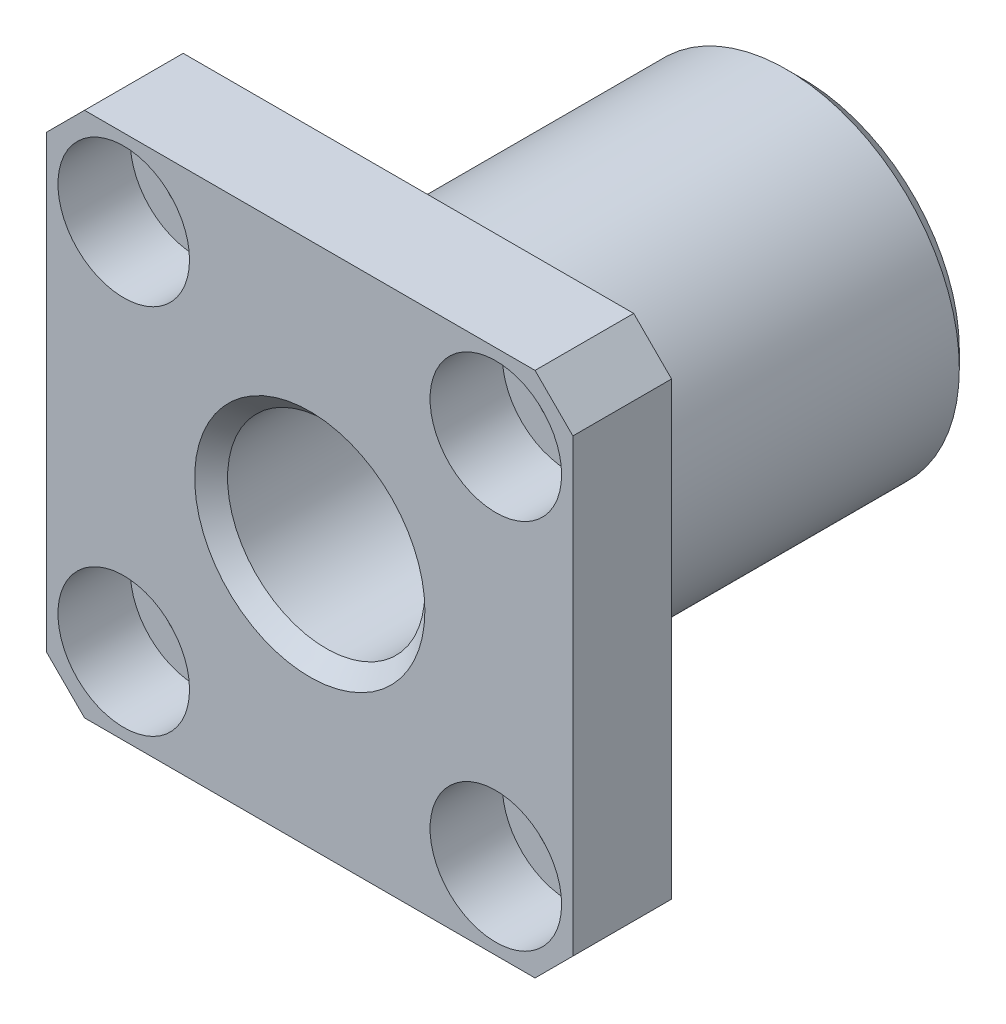
ISO-10303-21;
HEADER;
FILE_DESCRIPTION(('STEP AP214'),'2;1');
FILE_NAME('part.step','',(''),(''),'','','');
FILE_SCHEMA(('AUTOMOTIVE_DESIGN { 1 0 10303 214 1 1 1 1 }'));
ENDSEC;
DATA;
#1=APPLICATION_CONTEXT('core data for automotive mechanical design processes');
#2=APPLICATION_PROTOCOL_DEFINITION('international standard','automotive_design',2000,#1);
#3=PRODUCT_CONTEXT('',#1,'mechanical');
#4=PRODUCT('Part','Part','',(#3));
#5=PRODUCT_RELATED_PRODUCT_CATEGORY('part','',(#4));
#6=PRODUCT_DEFINITION_FORMATION('','',#4);
#7=PRODUCT_DEFINITION_CONTEXT('part definition',#1,'design');
#8=PRODUCT_DEFINITION('design','',#6,#7);
#9=PRODUCT_DEFINITION_SHAPE('','',#8);
#10=(LENGTH_UNIT() NAMED_UNIT(*) SI_UNIT(.MILLI.,.METRE.));
#11=(NAMED_UNIT(*) PLANE_ANGLE_UNIT() SI_UNIT($,.RADIAN.));
#12=(NAMED_UNIT(*) SI_UNIT($,.STERADIAN.) SOLID_ANGLE_UNIT());
#13=UNCERTAINTY_MEASURE_WITH_UNIT(LENGTH_MEASURE(1.E-05),#10,'distance_accuracy_value','');
#14=(GEOMETRIC_REPRESENTATION_CONTEXT(3) GLOBAL_UNCERTAINTY_ASSIGNED_CONTEXT((#13)) GLOBAL_UNIT_ASSIGNED_CONTEXT((#10,
#11,#12)) REPRESENTATION_CONTEXT('',''));
#15=CARTESIAN_POINT('',(0.,0.,0.));
#16=DIRECTION('',(0.,0.,1.));
#17=DIRECTION('',(1.,0.,0.));
#18=AXIS2_PLACEMENT_3D('',#15,#16,#17);
#19=CARTESIAN_POINT('',(0.,0.,30.));
#20=DIRECTION('',(0.,0.,-1.));
#21=DIRECTION('',(-1.,0.,0.));
#22=AXIS2_PLACEMENT_3D('',#19,#20,#21);
#23=CYLINDRICAL_SURFACE('',#22,10.5);
#24=CARTESIAN_POINT('',(0.,0.,1.00000000000001));
#25=DIRECTION('',(0.,0.,1.));
#26=DIRECTION('',(1.,0.,0.));
#27=AXIS2_PLACEMENT_3D('',#24,#25,#26);
#28=CIRCLE('',#27,10.5);
#29=CARTESIAN_POINT('',(10.5,0.,1.00000000000001));
#30=VERTEX_POINT('',#29);
#31=EDGE_CURVE('E141',#30,#30,#28,.T.);
#32=ORIENTED_EDGE('',*,*,#31,.T.);
#33=EDGE_LOOP('',(#32));
#34=FACE_BOUND('',#33,.T.);
#35=CARTESIAN_POINT('',(0.,0.,24.));
#36=DIRECTION('',(0.,0.,-1.));
#37=DIRECTION('',(-1.,0.,0.));
#38=AXIS2_PLACEMENT_3D('',#35,#36,#37);
#39=CIRCLE('',#38,10.5);
#40=CARTESIAN_POINT('',(-10.5,0.,24.));
#41=VERTEX_POINT('',#40);
#42=EDGE_CURVE('E138',#41,#41,#39,.T.);
#43=ORIENTED_EDGE('',*,*,#42,.T.);
#44=EDGE_LOOP('',(#43));
#45=FACE_BOUND('',#44,.T.);
#46=ADVANCED_FACE('F33',(#34,#45),#23,.T.);
#47=CARTESIAN_POINT('',(0.,0.,0.));
#48=DIRECTION('',(0.,0.,1.));
#49=DIRECTION('',(1.,0.,0.));
#50=AXIS2_PLACEMENT_3D('',#47,#48,#49);
#51=PLANE('',#50);
#52=CARTESIAN_POINT('',(0.,0.,0.));
#53=DIRECTION('',(0.,0.,1.));
#54=DIRECTION('',(1.,0.,0.));
#55=AXIS2_PLACEMENT_3D('',#52,#53,#54);
#56=CIRCLE('',#55,9.49999999999998);
#57=CARTESIAN_POINT('',(9.49999999999998,0.,0.));
#58=VERTEX_POINT('',#57);
#59=EDGE_CURVE('E164',#58,#58,#56,.F.);
#60=ORIENTED_EDGE('',*,*,#59,.T.);
#61=EDGE_LOOP('',(#60));
#62=FACE_BOUND('',#61,.T.);
#63=CARTESIAN_POINT('',(0.,0.,0.));
#64=DIRECTION('',(0.,0.,1.));
#65=DIRECTION('',(1.,0.,0.));
#66=AXIS2_PLACEMENT_3D('',#63,#64,#65);
#67=CIRCLE('',#66,6.);
#68=CARTESIAN_POINT('',(6.,0.,0.));
#69=VERTEX_POINT('',#68);
#70=EDGE_CURVE('E442',#69,#69,#67,.T.);
#71=ORIENTED_EDGE('',*,*,#70,.T.);
#72=EDGE_LOOP('',(#71));
#73=FACE_BOUND('',#72,.T.);
#74=ADVANCED_FACE('F181',(#62,#73),#51,.F.);
#75=CARTESIAN_POINT('',(16.,-16.,24.));
#76=DIRECTION('',(1.,0.,0.));
#77=DIRECTION('',(0.,0.,-1.));
#78=AXIS2_PLACEMENT_3D('',#75,#76,#77);
#79=PLANE('',#78);
#80=DIRECTION('',(0.,0.,1.));
#81=VECTOR('',#80,1.);
#82=CARTESIAN_POINT('',(16.,-13.698484809835,0.));
#83=LINE('',#82,#81);
#84=CARTESIAN_POINT('',(16.,-13.698484809835,24.));
#85=VERTEX_POINT('',#84);
#86=CARTESIAN_POINT('',(16.,-13.698484809835,30.));
#87=VERTEX_POINT('',#86);
#88=EDGE_CURVE('E474',#85,#87,#83,.T.);
#89=ORIENTED_EDGE('',*,*,#88,.F.);
#90=DIRECTION('',(0.,1.,0.));
#91=VECTOR('',#90,1.);
#92=CARTESIAN_POINT('',(16.,-16.,24.));
#93=LINE('',#92,#91);
#94=CARTESIAN_POINT('',(16.,13.698484809835,24.));
#95=VERTEX_POINT('',#94);
#96=EDGE_CURVE('E117',#85,#95,#93,.T.);
#97=ORIENTED_EDGE('',*,*,#96,.T.);
#98=DIRECTION('',(0.,0.,1.));
#99=VECTOR('',#98,1.);
#100=CARTESIAN_POINT('',(16.,13.698484809835,0.));
#101=LINE('',#100,#99);
#102=CARTESIAN_POINT('',(16.,13.698484809835,30.));
#103=VERTEX_POINT('',#102);
#104=EDGE_CURVE('E100',#95,#103,#101,.T.);
#105=ORIENTED_EDGE('',*,*,#104,.T.);
#106=DIRECTION('',(0.,1.,0.));
#107=VECTOR('',#106,1.);
#108=CARTESIAN_POINT('',(16.,-16.,30.));
#109=LINE('',#108,#107);
#110=EDGE_CURVE('E115',#87,#103,#109,.T.);
#111=ORIENTED_EDGE('',*,*,#110,.F.);
#112=EDGE_LOOP('',(#89,#97,#105,#111));
#113=FACE_BOUND('',#112,.T.);
#114=ADVANCED_FACE('F114',(#113),#79,.T.);
#115=CARTESIAN_POINT('',(-16.,-16.,24.));
#116=DIRECTION('',(0.,-1.,0.));
#117=DIRECTION('',(0.,0.,-1.));
#118=AXIS2_PLACEMENT_3D('',#115,#116,#117);
#119=PLANE('',#118);
#120=DIRECTION('',(0.,0.,1.));
#121=VECTOR('',#120,1.);
#122=CARTESIAN_POINT('',(-13.698484809835,-16.,0.));
#123=LINE('',#122,#121);
#124=CARTESIAN_POINT('',(-13.698484809835,-16.,24.));
#125=VERTEX_POINT('',#124);
#126=CARTESIAN_POINT('',(-13.698484809835,-16.,30.));
#127=VERTEX_POINT('',#126);
#128=EDGE_CURVE('E48',#125,#127,#123,.T.);
#129=ORIENTED_EDGE('',*,*,#128,.F.);
#130=DIRECTION('',(1.,0.,0.));
#131=VECTOR('',#130,1.);
#132=CARTESIAN_POINT('',(-16.,-16.,24.));
#133=LINE('',#132,#131);
#134=CARTESIAN_POINT('',(13.698484809835,-16.,24.));
#135=VERTEX_POINT('',#134);
#136=EDGE_CURVE('E131',#125,#135,#133,.T.);
#137=ORIENTED_EDGE('',*,*,#136,.T.);
#138=DIRECTION('',(0.,0.,1.));
#139=VECTOR('',#138,1.);
#140=CARTESIAN_POINT('',(13.698484809835,-16.,0.));
#141=LINE('',#140,#139);
#142=CARTESIAN_POINT('',(13.698484809835,-16.,30.));
#143=VERTEX_POINT('',#142);
#144=EDGE_CURVE('E108',#135,#143,#141,.T.);
#145=ORIENTED_EDGE('',*,*,#144,.T.);
#146=DIRECTION('',(1.,0.,0.));
#147=VECTOR('',#146,1.);
#148=CARTESIAN_POINT('',(-16.,-16.,30.));
#149=LINE('',#148,#147);
#150=EDGE_CURVE('E136',#127,#143,#149,.T.);
#151=ORIENTED_EDGE('',*,*,#150,.F.);
#152=EDGE_LOOP('',(#129,#137,#145,#151));
#153=FACE_BOUND('',#152,.T.);
#154=ADVANCED_FACE('F198',(#153),#119,.T.);
#155=CARTESIAN_POINT('',(-16.,-16.,24.));
#156=DIRECTION('',(-1.,0.,0.));
#157=DIRECTION('',(0.,0.,1.));
#158=AXIS2_PLACEMENT_3D('',#155,#156,#157);
#159=PLANE('',#158);
#160=DIRECTION('',(0.,0.,1.));
#161=VECTOR('',#160,1.);
#162=CARTESIAN_POINT('',(-16.,-13.698484809835,0.));
#163=LINE('',#162,#161);
#164=CARTESIAN_POINT('',(-16.,-13.698484809835,24.));
#165=VERTEX_POINT('',#164);
#166=CARTESIAN_POINT('',(-16.,-13.698484809835,30.));
#167=VERTEX_POINT('',#166);
#168=EDGE_CURVE('E479',#165,#167,#163,.T.);
#169=ORIENTED_EDGE('',*,*,#168,.T.);
#170=DIRECTION('',(0.,-1.,0.));
#171=VECTOR('',#170,1.);
#172=CARTESIAN_POINT('',(-16.,-16.,30.));
#173=LINE('',#172,#171);
#174=CARTESIAN_POINT('',(-16.,13.698484809835,30.));
#175=VERTEX_POINT('',#174);
#176=EDGE_CURVE('E126',#175,#167,#173,.T.);
#177=ORIENTED_EDGE('',*,*,#176,.F.);
#178=DIRECTION('',(0.,0.,1.));
#179=VECTOR('',#178,1.);
#180=CARTESIAN_POINT('',(-16.,13.698484809835,0.));
#181=LINE('',#180,#179);
#182=CARTESIAN_POINT('',(-16.,13.698484809835,24.));
#183=VERTEX_POINT('',#182);
#184=EDGE_CURVE('E56',#183,#175,#181,.T.);
#185=ORIENTED_EDGE('',*,*,#184,.F.);
#186=DIRECTION('',(0.,-1.,0.));
#187=VECTOR('',#186,1.);
#188=CARTESIAN_POINT('',(-16.,-16.,24.));
#189=LINE('',#188,#187);
#190=EDGE_CURVE('E496',#183,#165,#189,.T.);
#191=ORIENTED_EDGE('',*,*,#190,.T.);
#192=EDGE_LOOP('',(#169,#177,#185,#191));
#193=FACE_BOUND('',#192,.T.);
#194=ADVANCED_FACE('F202',(#193),#159,.T.);
#195=CARTESIAN_POINT('',(-16.,16.,24.));
#196=DIRECTION('',(0.,1.,0.));
#197=DIRECTION('',(0.,0.,1.));
#198=AXIS2_PLACEMENT_3D('',#195,#196,#197);
#199=PLANE('',#198);
#200=DIRECTION('',(0.,0.,1.));
#201=VECTOR('',#200,1.);
#202=CARTESIAN_POINT('',(13.698484809835,16.,0.));
#203=LINE('',#202,#201);
#204=CARTESIAN_POINT('',(13.698484809835,16.,24.));
#205=VERTEX_POINT('',#204);
#206=CARTESIAN_POINT('',(13.698484809835,16.,30.));
#207=VERTEX_POINT('',#206);
#208=EDGE_CURVE('E103',#205,#207,#203,.T.);
#209=ORIENTED_EDGE('',*,*,#208,.F.);
#210=DIRECTION('',(-1.,0.,0.));
#211=VECTOR('',#210,1.);
#212=CARTESIAN_POINT('',(-16.,16.,24.));
#213=LINE('',#212,#211);
#214=CARTESIAN_POINT('',(-13.698484809835,16.,24.));
#215=VERTEX_POINT('',#214);
#216=EDGE_CURVE('E494',#205,#215,#213,.T.);
#217=ORIENTED_EDGE('',*,*,#216,.T.);
#218=DIRECTION('',(0.,0.,1.));
#219=VECTOR('',#218,1.);
#220=CARTESIAN_POINT('',(-13.698484809835,16.,0.));
#221=LINE('',#220,#219);
#222=CARTESIAN_POINT('',(-13.698484809835,16.,30.));
#223=VERTEX_POINT('',#222);
#224=EDGE_CURVE('E484',#215,#223,#221,.T.);
#225=ORIENTED_EDGE('',*,*,#224,.T.);
#226=DIRECTION('',(-1.,0.,0.));
#227=VECTOR('',#226,1.);
#228=CARTESIAN_POINT('',(-16.,16.,30.));
#229=LINE('',#228,#227);
#230=EDGE_CURVE('E123',#207,#223,#229,.T.);
#231=ORIENTED_EDGE('',*,*,#230,.F.);
#232=EDGE_LOOP('',(#209,#217,#225,#231));
#233=FACE_BOUND('',#232,.T.);
#234=ADVANCED_FACE('F199',(#233),#199,.T.);
#235=CARTESIAN_POINT('',(0.,0.,24.));
#236=DIRECTION('',(0.,0.,-1.));
#237=DIRECTION('',(-1.,0.,0.));
#238=AXIS2_PLACEMENT_3D('',#235,#236,#237);
#239=PLANE('',#238);
#240=CARTESIAN_POINT('',(-11.3137084989848,11.3137084989848,24.));
#241=DIRECTION('',(0.,0.,-1.));
#242=DIRECTION('',(-1.,0.,0.));
#243=AXIS2_PLACEMENT_3D('',#240,#241,#242);
#244=CIRCLE('',#243,2.25);
#245=CARTESIAN_POINT('',(-13.5637084989848,11.3137084989848,24.));
#246=VERTEX_POINT('',#245);
#247=EDGE_CURVE('E157',#246,#246,#244,.T.);
#248=ORIENTED_EDGE('',*,*,#247,.F.);
#249=EDGE_LOOP('',(#248));
#250=FACE_BOUND('',#249,.T.);
#251=CARTESIAN_POINT('',(11.3137084989848,11.3137084989848,24.));
#252=DIRECTION('',(0.,0.,-1.));
#253=DIRECTION('',(-1.,0.,0.));
#254=AXIS2_PLACEMENT_3D('',#251,#252,#253);
#255=CIRCLE('',#254,2.25);
#256=CARTESIAN_POINT('',(9.06370849898476,11.3137084989848,24.));
#257=VERTEX_POINT('',#256);
#258=EDGE_CURVE('E152',#257,#257,#255,.T.);
#259=ORIENTED_EDGE('',*,*,#258,.F.);
#260=EDGE_LOOP('',(#259));
#261=FACE_BOUND('',#260,.T.);
#262=CARTESIAN_POINT('',(11.3137084989848,-11.3137084989848,24.));
#263=DIRECTION('',(0.,0.,-1.));
#264=DIRECTION('',(-1.,0.,0.));
#265=AXIS2_PLACEMENT_3D('',#262,#263,#264);
#266=CIRCLE('',#265,2.25);
#267=CARTESIAN_POINT('',(9.06370849898476,-11.3137084989848,24.));
#268=VERTEX_POINT('',#267);
#269=EDGE_CURVE('E147',#268,#268,#266,.T.);
#270=ORIENTED_EDGE('',*,*,#269,.F.);
#271=EDGE_LOOP('',(#270));
#272=FACE_BOUND('',#271,.T.);
#273=CARTESIAN_POINT('',(-11.3137084989848,-11.3137084989848,24.));
#274=DIRECTION('',(0.,0.,-1.));
#275=DIRECTION('',(-1.,0.,0.));
#276=AXIS2_PLACEMENT_3D('',#273,#274,#275);
#277=CIRCLE('',#276,2.25);
#278=CARTESIAN_POINT('',(-13.5637084989848,-11.3137084989848,24.));
#279=VERTEX_POINT('',#278);
#280=EDGE_CURVE('E142',#279,#279,#277,.T.);
#281=ORIENTED_EDGE('',*,*,#280,.F.);
#282=EDGE_LOOP('',(#281));
#283=FACE_BOUND('',#282,.T.);
#284=DIRECTION('',(0.707106781186548,-0.707106781186548,0.));
#285=VECTOR('',#284,1.);
#286=CARTESIAN_POINT('',(-14.8492424049175,-14.8492424049175,24.));
#287=LINE('',#286,#285);
#288=EDGE_CURVE('E124',#165,#125,#287,.T.);
#289=ORIENTED_EDGE('',*,*,#288,.F.);
#290=ORIENTED_EDGE('',*,*,#190,.F.);
#291=DIRECTION('',(-0.707106781186548,-0.707106781186548,0.));
#292=VECTOR('',#291,1.);
#293=CARTESIAN_POINT('',(-14.8492424049175,14.8492424049175,24.));
#294=LINE('',#293,#292);
#295=EDGE_CURVE('E487',#215,#183,#294,.T.);
#296=ORIENTED_EDGE('',*,*,#295,.F.);
#297=ORIENTED_EDGE('',*,*,#216,.F.);
#298=DIRECTION('',(-0.707106781186548,0.707106781186548,0.));
#299=VECTOR('',#298,1.);
#300=CARTESIAN_POINT('',(14.8492424049175,14.8492424049175,24.));
#301=LINE('',#300,#299);
#302=EDGE_CURVE('E490',#95,#205,#301,.T.);
#303=ORIENTED_EDGE('',*,*,#302,.F.);
#304=ORIENTED_EDGE('',*,*,#96,.F.);
#305=DIRECTION('',(0.707106781186548,0.707106781186548,0.));
#306=VECTOR('',#305,1.);
#307=CARTESIAN_POINT('',(14.8492424049175,-14.8492424049175,24.));
#308=LINE('',#307,#306);
#309=EDGE_CURVE('E128',#135,#85,#308,.T.);
#310=ORIENTED_EDGE('',*,*,#309,.F.);
#311=ORIENTED_EDGE('',*,*,#136,.F.);
#312=EDGE_LOOP('',(#289,#290,#296,#297,#303,#304,#310,#311));
#313=FACE_BOUND('',#312,.T.);
#314=ORIENTED_EDGE('',*,*,#42,.F.);
#315=EDGE_LOOP('',(#314));
#316=FACE_BOUND('',#315,.T.);
#317=ADVANCED_FACE('F194',(#250,#261,#272,#283,#313,#316),#239,.T.);
#318=CARTESIAN_POINT('',(0.,0.,30.));
#319=DIRECTION('',(0.,0.,1.));
#320=DIRECTION('',(1.,0.,0.));
#321=AXIS2_PLACEMENT_3D('',#318,#319,#320);
#322=PLANE('',#321);
#323=CARTESIAN_POINT('',(0.,0.,30.));
#324=DIRECTION('',(0.,0.,1.));
#325=DIRECTION('',(1.,0.,0.));
#326=AXIS2_PLACEMENT_3D('',#323,#324,#325);
#327=CIRCLE('',#326,7.00000000000001);
#328=CARTESIAN_POINT('',(7.00000000000001,0.,30.));
#329=VERTEX_POINT('',#328);
#330=EDGE_CURVE('E11',#329,#329,#327,.F.);
#331=ORIENTED_EDGE('',*,*,#330,.T.);
#332=EDGE_LOOP('',(#331));
#333=FACE_BOUND('',#332,.T.);
#334=CARTESIAN_POINT('',(-11.3137084989848,11.3137084989848,30.));
#335=DIRECTION('',(0.,0.,1.));
#336=DIRECTION('',(1.,0.,0.));
#337=AXIS2_PLACEMENT_3D('',#334,#335,#336);
#338=CIRCLE('',#337,4.);
#339=CARTESIAN_POINT('',(-7.31370849898476,11.3137084989848,30.));
#340=VERTEX_POINT('',#339);
#341=EDGE_CURVE('E440',#340,#340,#338,.T.);
#342=ORIENTED_EDGE('',*,*,#341,.F.);
#343=EDGE_LOOP('',(#342));
#344=FACE_BOUND('',#343,.T.);
#345=CARTESIAN_POINT('',(11.3137084989848,11.3137084989848,30.));
#346=DIRECTION('',(0.,0.,1.));
#347=DIRECTION('',(1.,0.,0.));
#348=AXIS2_PLACEMENT_3D('',#345,#346,#347);
#349=CIRCLE('',#348,4.);
#350=CARTESIAN_POINT('',(15.3137084989848,11.3137084989848,30.));
#351=VERTEX_POINT('',#350);
#352=EDGE_CURVE('E160',#351,#351,#349,.T.);
#353=ORIENTED_EDGE('',*,*,#352,.F.);
#354=EDGE_LOOP('',(#353));
#355=FACE_BOUND('',#354,.T.);
#356=CARTESIAN_POINT('',(11.3137084989848,-11.3137084989848,30.));
#357=DIRECTION('',(0.,0.,1.));
#358=DIRECTION('',(1.,0.,0.));
#359=AXIS2_PLACEMENT_3D('',#356,#357,#358);
#360=CIRCLE('',#359,4.);
#361=CARTESIAN_POINT('',(15.3137084989848,-11.3137084989848,30.));
#362=VERTEX_POINT('',#361);
#363=EDGE_CURVE('E155',#362,#362,#360,.T.);
#364=ORIENTED_EDGE('',*,*,#363,.F.);
#365=EDGE_LOOP('',(#364));
#366=FACE_BOUND('',#365,.T.);
#367=CARTESIAN_POINT('',(-11.3137084989848,-11.3137084989848,30.));
#368=DIRECTION('',(0.,0.,1.));
#369=DIRECTION('',(1.,0.,0.));
#370=AXIS2_PLACEMENT_3D('',#367,#368,#369);
#371=CIRCLE('',#370,4.);
#372=CARTESIAN_POINT('',(-7.31370849898476,-11.3137084989848,30.));
#373=VERTEX_POINT('',#372);
#374=EDGE_CURVE('E150',#373,#373,#371,.T.);
#375=ORIENTED_EDGE('',*,*,#374,.F.);
#376=EDGE_LOOP('',(#375));
#377=FACE_BOUND('',#376,.T.);
#378=DIRECTION('',(-0.707106781186548,0.707106781186548,0.));
#379=VECTOR('',#378,1.);
#380=CARTESIAN_POINT('',(-16.,-13.698484809835,30.));
#381=LINE('',#380,#379);
#382=EDGE_CURVE('E145',#127,#167,#381,.T.);
#383=ORIENTED_EDGE('',*,*,#382,.F.);
#384=ORIENTED_EDGE('',*,*,#150,.T.);
#385=DIRECTION('',(-0.707106781186548,-0.707106781186548,0.));
#386=VECTOR('',#385,1.);
#387=CARTESIAN_POINT('',(16.,-13.698484809835,30.));
#388=LINE('',#387,#386);
#389=EDGE_CURVE('E122',#87,#143,#388,.T.);
#390=ORIENTED_EDGE('',*,*,#389,.F.);
#391=ORIENTED_EDGE('',*,*,#110,.T.);
#392=DIRECTION('',(0.707106781186548,-0.707106781186548,0.));
#393=VECTOR('',#392,1.);
#394=CARTESIAN_POINT('',(16.,13.698484809835,30.));
#395=LINE('',#394,#393);
#396=EDGE_CURVE('E97',#207,#103,#395,.T.);
#397=ORIENTED_EDGE('',*,*,#396,.F.);
#398=ORIENTED_EDGE('',*,*,#230,.T.);
#399=DIRECTION('',(0.707106781186548,0.707106781186548,0.));
#400=VECTOR('',#399,1.);
#401=CARTESIAN_POINT('',(-16.,13.698484809835,30.));
#402=LINE('',#401,#400);
#403=EDGE_CURVE('E471',#175,#223,#402,.T.);
#404=ORIENTED_EDGE('',*,*,#403,.F.);
#405=ORIENTED_EDGE('',*,*,#176,.T.);
#406=EDGE_LOOP('',(#383,#384,#390,#391,#397,#398,#404,#405));
#407=FACE_BOUND('',#406,.T.);
#408=ADVANCED_FACE('F120',(#333,#344,#355,#366,#377,#407),#322,.T.);
#409=CARTESIAN_POINT('',(-16.,13.698484809835,0.));
#410=DIRECTION('',(0.707106781186547,-0.707106781186547,0.));
#411=DIRECTION('',(0.707106781186548,0.707106781186548,0.));
#412=AXIS2_PLACEMENT_3D('',#409,#410,#411);
#413=PLANE('',#412);
#414=ORIENTED_EDGE('',*,*,#295,.T.);
#415=ORIENTED_EDGE('',*,*,#184,.T.);
#416=ORIENTED_EDGE('',*,*,#403,.T.);
#417=ORIENTED_EDGE('',*,*,#224,.F.);
#418=EDGE_LOOP('',(#414,#415,#416,#417));
#419=FACE_BOUND('',#418,.T.);
#420=ADVANCED_FACE('F193',(#419),#413,.F.);
#421=CARTESIAN_POINT('',(16.,13.698484809835,0.));
#422=DIRECTION('',(-0.707106781186547,-0.707106781186547,0.));
#423=DIRECTION('',(0.707106781186548,-0.707106781186548,0.));
#424=AXIS2_PLACEMENT_3D('',#421,#422,#423);
#425=PLANE('',#424);
#426=ORIENTED_EDGE('',*,*,#302,.T.);
#427=ORIENTED_EDGE('',*,*,#208,.T.);
#428=ORIENTED_EDGE('',*,*,#396,.T.);
#429=ORIENTED_EDGE('',*,*,#104,.F.);
#430=EDGE_LOOP('',(#426,#427,#428,#429));
#431=FACE_BOUND('',#430,.T.);
#432=ADVANCED_FACE('F99',(#431),#425,.F.);
#433=CARTESIAN_POINT('',(16.,-13.698484809835,0.));
#434=DIRECTION('',(-0.707106781186547,0.707106781186547,0.));
#435=DIRECTION('',(-0.707106781186548,-0.707106781186548,0.));
#436=AXIS2_PLACEMENT_3D('',#433,#434,#435);
#437=PLANE('',#436);
#438=ORIENTED_EDGE('',*,*,#309,.T.);
#439=ORIENTED_EDGE('',*,*,#88,.T.);
#440=ORIENTED_EDGE('',*,*,#389,.T.);
#441=ORIENTED_EDGE('',*,*,#144,.F.);
#442=EDGE_LOOP('',(#438,#439,#440,#441));
#443=FACE_BOUND('',#442,.T.);
#444=ADVANCED_FACE('F219',(#443),#437,.F.);
#445=CARTESIAN_POINT('',(-16.,-13.698484809835,0.));
#446=DIRECTION('',(0.707106781186547,0.707106781186547,0.));
#447=DIRECTION('',(-0.707106781186548,0.707106781186548,0.));
#448=AXIS2_PLACEMENT_3D('',#445,#446,#447);
#449=PLANE('',#448);
#450=ORIENTED_EDGE('',*,*,#288,.T.);
#451=ORIENTED_EDGE('',*,*,#128,.T.);
#452=ORIENTED_EDGE('',*,*,#382,.T.);
#453=ORIENTED_EDGE('',*,*,#168,.F.);
#454=EDGE_LOOP('',(#450,#451,#452,#453));
#455=FACE_BOUND('',#454,.T.);
#456=ADVANCED_FACE('F215',(#455),#449,.F.);
#457=CARTESIAN_POINT('',(-11.3137084989848,-11.3137084989848,30.));
#458=DIRECTION('',(0.,0.,1.));
#459=DIRECTION('',(1.,0.,0.));
#460=AXIS2_PLACEMENT_3D('',#457,#458,#459);
#461=CYLINDRICAL_SURFACE('',#460,2.25);
#462=ORIENTED_EDGE('',*,*,#280,.T.);
#463=EDGE_LOOP('',(#462));
#464=FACE_BOUND('',#463,.T.);
#465=CARTESIAN_POINT('',(-11.3137084989848,-11.3137084989848,25.6));
#466=DIRECTION('',(0.,0.,1.));
#467=DIRECTION('',(1.,0.,0.));
#468=AXIS2_PLACEMENT_3D('',#465,#466,#467);
#469=CIRCLE('',#468,2.25);
#470=CARTESIAN_POINT('',(-9.06370849898476,-11.3137084989848,25.6));
#471=VERTEX_POINT('',#470);
#472=EDGE_CURVE('E146',#471,#471,#469,.T.);
#473=ORIENTED_EDGE('',*,*,#472,.T.);
#474=EDGE_LOOP('',(#473));
#475=FACE_BOUND('',#474,.T.);
#476=ADVANCED_FACE('F218',(#464,#475),#461,.F.);
#477=CARTESIAN_POINT('',(-9.06370849898476,-11.3137084989848,25.6));
#478=DIRECTION('',(0.,0.,-1.));
#479=DIRECTION('',(-1.,0.,0.));
#480=AXIS2_PLACEMENT_3D('',#477,#478,#479);
#481=PLANE('',#480);
#482=ORIENTED_EDGE('',*,*,#472,.F.);
#483=EDGE_LOOP('',(#482));
#484=FACE_BOUND('',#483,.T.);
#485=CARTESIAN_POINT('',(-11.3137084989848,-11.3137084989848,25.6));
#486=DIRECTION('',(0.,0.,1.));
#487=DIRECTION('',(1.,0.,0.));
#488=AXIS2_PLACEMENT_3D('',#485,#486,#487);
#489=CIRCLE('',#488,4.);
#490=CARTESIAN_POINT('',(-7.31370849898476,-11.3137084989848,25.6));
#491=VERTEX_POINT('',#490);
#492=EDGE_CURVE('E466',#491,#491,#489,.T.);
#493=ORIENTED_EDGE('',*,*,#492,.T.);
#494=EDGE_LOOP('',(#493));
#495=FACE_BOUND('',#494,.T.);
#496=ADVANCED_FACE('F227',(#484,#495),#481,.F.);
#497=CARTESIAN_POINT('',(-11.3137084989848,-11.3137084989848,30.));
#498=DIRECTION('',(0.,0.,1.));
#499=DIRECTION('',(1.,0.,0.));
#500=AXIS2_PLACEMENT_3D('',#497,#498,#499);
#501=CYLINDRICAL_SURFACE('',#500,4.);
#502=ORIENTED_EDGE('',*,*,#492,.F.);
#503=EDGE_LOOP('',(#502));
#504=FACE_BOUND('',#503,.T.);
#505=ORIENTED_EDGE('',*,*,#374,.T.);
#506=EDGE_LOOP('',(#505));
#507=FACE_BOUND('',#506,.T.);
#508=ADVANCED_FACE('F231',(#504,#507),#501,.F.);
#509=CARTESIAN_POINT('',(11.3137084989848,-11.3137084989848,30.));
#510=DIRECTION('',(0.,0.,1.));
#511=DIRECTION('',(1.,0.,0.));
#512=AXIS2_PLACEMENT_3D('',#509,#510,#511);
#513=CYLINDRICAL_SURFACE('',#512,2.25);
#514=ORIENTED_EDGE('',*,*,#269,.T.);
#515=EDGE_LOOP('',(#514));
#516=FACE_BOUND('',#515,.T.);
#517=CARTESIAN_POINT('',(11.3137084989848,-11.3137084989848,25.6));
#518=DIRECTION('',(0.,0.,1.));
#519=DIRECTION('',(1.,0.,0.));
#520=AXIS2_PLACEMENT_3D('',#517,#518,#519);
#521=CIRCLE('',#520,2.25);
#522=CARTESIAN_POINT('',(13.5637084989848,-11.3137084989848,25.6));
#523=VERTEX_POINT('',#522);
#524=EDGE_CURVE('E151',#523,#523,#521,.T.);
#525=ORIENTED_EDGE('',*,*,#524,.T.);
#526=EDGE_LOOP('',(#525));
#527=FACE_BOUND('',#526,.T.);
#528=ADVANCED_FACE('F235',(#516,#527),#513,.F.);
#529=CARTESIAN_POINT('',(13.5637084989848,-11.3137084989848,25.6));
#530=DIRECTION('',(0.,0.,-1.));
#531=DIRECTION('',(-1.,0.,0.));
#532=AXIS2_PLACEMENT_3D('',#529,#530,#531);
#533=PLANE('',#532);
#534=ORIENTED_EDGE('',*,*,#524,.F.);
#535=EDGE_LOOP('',(#534));
#536=FACE_BOUND('',#535,.T.);
#537=CARTESIAN_POINT('',(11.3137084989848,-11.3137084989848,25.6));
#538=DIRECTION('',(0.,0.,1.));
#539=DIRECTION('',(1.,0.,0.));
#540=AXIS2_PLACEMENT_3D('',#537,#538,#539);
#541=CIRCLE('',#540,4.);
#542=CARTESIAN_POINT('',(15.3137084989848,-11.3137084989848,25.6));
#543=VERTEX_POINT('',#542);
#544=EDGE_CURVE('E459',#543,#543,#541,.T.);
#545=ORIENTED_EDGE('',*,*,#544,.T.);
#546=EDGE_LOOP('',(#545));
#547=FACE_BOUND('',#546,.T.);
#548=ADVANCED_FACE('F239',(#536,#547),#533,.F.);
#549=CARTESIAN_POINT('',(11.3137084989848,-11.3137084989848,30.));
#550=DIRECTION('',(0.,0.,1.));
#551=DIRECTION('',(1.,0.,0.));
#552=AXIS2_PLACEMENT_3D('',#549,#550,#551);
#553=CYLINDRICAL_SURFACE('',#552,4.);
#554=ORIENTED_EDGE('',*,*,#544,.F.);
#555=EDGE_LOOP('',(#554));
#556=FACE_BOUND('',#555,.T.);
#557=ORIENTED_EDGE('',*,*,#363,.T.);
#558=EDGE_LOOP('',(#557));
#559=FACE_BOUND('',#558,.T.);
#560=ADVANCED_FACE('F243',(#556,#559),#553,.F.);
#561=CARTESIAN_POINT('',(11.3137084989848,11.3137084989848,30.));
#562=DIRECTION('',(0.,0.,1.));
#563=DIRECTION('',(1.,0.,0.));
#564=AXIS2_PLACEMENT_3D('',#561,#562,#563);
#565=CYLINDRICAL_SURFACE('',#564,2.25);
#566=ORIENTED_EDGE('',*,*,#258,.T.);
#567=EDGE_LOOP('',(#566));
#568=FACE_BOUND('',#567,.T.);
#569=CARTESIAN_POINT('',(11.3137084989848,11.3137084989848,25.6));
#570=DIRECTION('',(0.,0.,1.));
#571=DIRECTION('',(1.,0.,0.));
#572=AXIS2_PLACEMENT_3D('',#569,#570,#571);
#573=CIRCLE('',#572,2.25);
#574=CARTESIAN_POINT('',(13.5637084989848,11.3137084989848,25.6));
#575=VERTEX_POINT('',#574);
#576=EDGE_CURVE('E156',#575,#575,#573,.T.);
#577=ORIENTED_EDGE('',*,*,#576,.T.);
#578=EDGE_LOOP('',(#577));
#579=FACE_BOUND('',#578,.T.);
#580=ADVANCED_FACE('F247',(#568,#579),#565,.F.);
#581=CARTESIAN_POINT('',(13.5637084989848,11.3137084989848,25.6));
#582=DIRECTION('',(0.,0.,-1.));
#583=DIRECTION('',(-1.,0.,0.));
#584=AXIS2_PLACEMENT_3D('',#581,#582,#583);
#585=PLANE('',#584);
#586=ORIENTED_EDGE('',*,*,#576,.F.);
#587=EDGE_LOOP('',(#586));
#588=FACE_BOUND('',#587,.T.);
#589=CARTESIAN_POINT('',(11.3137084989848,11.3137084989848,25.6));
#590=DIRECTION('',(0.,0.,1.));
#591=DIRECTION('',(1.,0.,0.));
#592=AXIS2_PLACEMENT_3D('',#589,#590,#591);
#593=CIRCLE('',#592,4.);
#594=CARTESIAN_POINT('',(15.3137084989848,11.3137084989848,25.6));
#595=VERTEX_POINT('',#594);
#596=EDGE_CURVE('E452',#595,#595,#593,.T.);
#597=ORIENTED_EDGE('',*,*,#596,.T.);
#598=EDGE_LOOP('',(#597));
#599=FACE_BOUND('',#598,.T.);
#600=ADVANCED_FACE('F251',(#588,#599),#585,.F.);
#601=CARTESIAN_POINT('',(11.3137084989848,11.3137084989848,30.));
#602=DIRECTION('',(0.,0.,1.));
#603=DIRECTION('',(1.,0.,0.));
#604=AXIS2_PLACEMENT_3D('',#601,#602,#603);
#605=CYLINDRICAL_SURFACE('',#604,4.);
#606=ORIENTED_EDGE('',*,*,#596,.F.);
#607=EDGE_LOOP('',(#606));
#608=FACE_BOUND('',#607,.T.);
#609=ORIENTED_EDGE('',*,*,#352,.T.);
#610=EDGE_LOOP('',(#609));
#611=FACE_BOUND('',#610,.T.);
#612=ADVANCED_FACE('F255',(#608,#611),#605,.F.);
#613=CARTESIAN_POINT('',(-11.3137084989848,11.3137084989848,30.));
#614=DIRECTION('',(0.,0.,1.));
#615=DIRECTION('',(1.,0.,0.));
#616=AXIS2_PLACEMENT_3D('',#613,#614,#615);
#617=CYLINDRICAL_SURFACE('',#616,2.25);
#618=ORIENTED_EDGE('',*,*,#247,.T.);
#619=EDGE_LOOP('',(#618));
#620=FACE_BOUND('',#619,.T.);
#621=CARTESIAN_POINT('',(-11.3137084989848,11.3137084989848,25.6));
#622=DIRECTION('',(0.,0.,1.));
#623=DIRECTION('',(1.,0.,0.));
#624=AXIS2_PLACEMENT_3D('',#621,#622,#623);
#625=CIRCLE('',#624,2.25);
#626=CARTESIAN_POINT('',(-9.06370849898476,11.3137084989848,25.6));
#627=VERTEX_POINT('',#626);
#628=EDGE_CURVE('E161',#627,#627,#625,.T.);
#629=ORIENTED_EDGE('',*,*,#628,.T.);
#630=EDGE_LOOP('',(#629));
#631=FACE_BOUND('',#630,.T.);
#632=ADVANCED_FACE('F259',(#620,#631),#617,.F.);
#633=CARTESIAN_POINT('',(-9.06370849898476,11.3137084989848,25.6));
#634=DIRECTION('',(0.,0.,-1.));
#635=DIRECTION('',(-1.,0.,0.));
#636=AXIS2_PLACEMENT_3D('',#633,#634,#635);
#637=PLANE('',#636);
#638=ORIENTED_EDGE('',*,*,#628,.F.);
#639=EDGE_LOOP('',(#638));
#640=FACE_BOUND('',#639,.T.);
#641=CARTESIAN_POINT('',(-11.3137084989848,11.3137084989848,25.6));
#642=DIRECTION('',(0.,0.,1.));
#643=DIRECTION('',(1.,0.,0.));
#644=AXIS2_PLACEMENT_3D('',#641,#642,#643);
#645=CIRCLE('',#644,4.);
#646=CARTESIAN_POINT('',(-7.31370849898476,11.3137084989848,25.6));
#647=VERTEX_POINT('',#646);
#648=EDGE_CURVE('E437',#647,#647,#645,.T.);
#649=ORIENTED_EDGE('',*,*,#648,.T.);
#650=EDGE_LOOP('',(#649));
#651=FACE_BOUND('',#650,.T.);
#652=ADVANCED_FACE('F263',(#640,#651),#637,.F.);
#653=CARTESIAN_POINT('',(-11.3137084989848,11.3137084989848,30.));
#654=DIRECTION('',(0.,0.,1.));
#655=DIRECTION('',(1.,0.,0.));
#656=AXIS2_PLACEMENT_3D('',#653,#654,#655);
#657=CYLINDRICAL_SURFACE('',#656,4.);
#658=ORIENTED_EDGE('',*,*,#648,.F.);
#659=EDGE_LOOP('',(#658));
#660=FACE_BOUND('',#659,.T.);
#661=ORIENTED_EDGE('',*,*,#341,.T.);
#662=EDGE_LOOP('',(#661));
#663=FACE_BOUND('',#662,.T.);
#664=ADVANCED_FACE('F267',(#660,#663),#657,.F.);
#665=CARTESIAN_POINT('',(0.,0.,0.));
#666=DIRECTION('',(0.,0.,1.));
#667=DIRECTION('',(1.,0.,0.));
#668=AXIS2_PLACEMENT_3D('',#665,#666,#667);
#669=CYLINDRICAL_SURFACE('',#668,6.);
#670=CARTESIAN_POINT('',(0.,0.,29.));
#671=DIRECTION('',(0.,0.,1.));
#672=DIRECTION('',(1.,0.,0.));
#673=AXIS2_PLACEMENT_3D('',#670,#671,#672);
#674=CIRCLE('',#673,6.);
#675=CARTESIAN_POINT('',(6.,0.,29.));
#676=VERTEX_POINT('',#675);
#677=EDGE_CURVE('E41',#676,#676,#674,.T.);
#678=ORIENTED_EDGE('',*,*,#677,.T.);
#679=EDGE_LOOP('',(#678));
#680=FACE_BOUND('',#679,.T.);
#681=ORIENTED_EDGE('',*,*,#70,.F.);
#682=EDGE_LOOP('',(#681));
#683=FACE_BOUND('',#682,.T.);
#684=ADVANCED_FACE('F169',(#680,#683),#669,.F.);
#685=CARTESIAN_POINT('',(0.,0.,1.00000000000001));
#686=DIRECTION('',(0.,0.,1.));
#687=DIRECTION('',(1.,0.,0.));
#688=AXIS2_PLACEMENT_3D('',#685,#686,#687);
#689=CONICAL_SURFACE('',#688,10.5,0.785398163397451);
#690=ORIENTED_EDGE('',*,*,#59,.F.);
#691=EDGE_LOOP('',(#690));
#692=FACE_BOUND('',#691,.T.);
#693=ORIENTED_EDGE('',*,*,#31,.F.);
#694=EDGE_LOOP('',(#693));
#695=FACE_BOUND('',#694,.T.);
#696=ADVANCED_FACE('F173',(#692,#695),#689,.T.);
#697=CARTESIAN_POINT('',(0.,0.,29.));
#698=DIRECTION('',(0.,0.,1.));
#699=DIRECTION('',(1.,0.,0.));
#700=AXIS2_PLACEMENT_3D('',#697,#698,#699);
#701=CONICAL_SURFACE('',#700,6.,0.785398163397447);
#702=ORIENTED_EDGE('',*,*,#330,.F.);
#703=EDGE_LOOP('',(#702));
#704=FACE_BOUND('',#703,.T.);
#705=ORIENTED_EDGE('',*,*,#677,.F.);
#706=EDGE_LOOP('',(#705));
#707=FACE_BOUND('',#706,.T.);
#708=ADVANCED_FACE('F35',(#704,#707),#701,.F.);
#709=CLOSED_SHELL('',(#46,#74,#114,#154,#194,#234,#317,#408,#420,#432,#444,#456,#476,#496,#508,
#528,#548,#560,#580,#600,#612,#632,#652,#664,#684,#696,#708));
#710=MANIFOLD_SOLID_BREP('B2',#709);
#711=ADVANCED_BREP_SHAPE_REPRESENTATION('',(#18,#710),#14);
#712=SHAPE_DEFINITION_REPRESENTATION(#9,#711);
ENDSEC;
END-ISO-10303-21;
